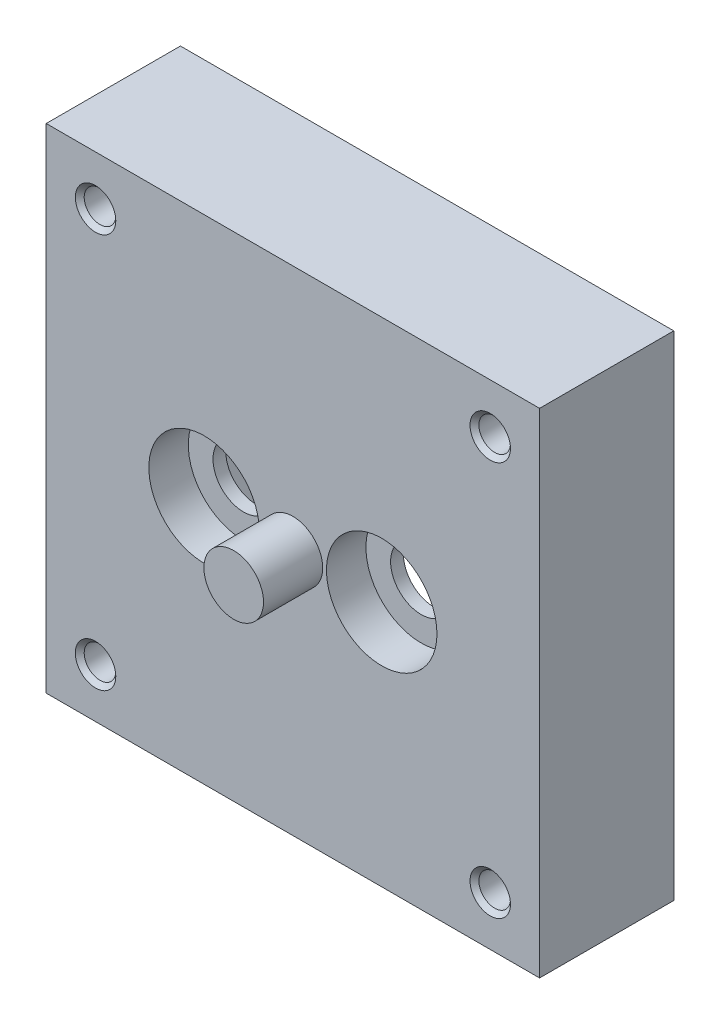
ISO-10303-21;
HEADER;
FILE_DESCRIPTION(('STEP AP214'),'2;1');
FILE_NAME('part.step','',(''),(''),'','','');
FILE_SCHEMA(('AUTOMOTIVE_DESIGN { 1 0 10303 214 1 1 1 1 }'));
ENDSEC;
DATA;
#1=APPLICATION_CONTEXT('core data for automotive mechanical design processes');
#2=APPLICATION_PROTOCOL_DEFINITION('international standard','automotive_design',2000,#1);
#3=PRODUCT_CONTEXT('',#1,'mechanical');
#4=PRODUCT('Part','Part','',(#3));
#5=PRODUCT_RELATED_PRODUCT_CATEGORY('part','',(#4));
#6=PRODUCT_DEFINITION_FORMATION('','',#4);
#7=PRODUCT_DEFINITION_CONTEXT('part definition',#1,'design');
#8=PRODUCT_DEFINITION('design','',#6,#7);
#9=PRODUCT_DEFINITION_SHAPE('','',#8);
#10=(LENGTH_UNIT() NAMED_UNIT(*) SI_UNIT(.MILLI.,.METRE.));
#11=(NAMED_UNIT(*) PLANE_ANGLE_UNIT() SI_UNIT($,.RADIAN.));
#12=(NAMED_UNIT(*) SI_UNIT($,.STERADIAN.) SOLID_ANGLE_UNIT());
#13=UNCERTAINTY_MEASURE_WITH_UNIT(LENGTH_MEASURE(1.E-05),#10,'distance_accuracy_value','');
#14=(GEOMETRIC_REPRESENTATION_CONTEXT(3) GLOBAL_UNCERTAINTY_ASSIGNED_CONTEXT((#13)) GLOBAL_UNIT_ASSIGNED_CONTEXT((#10,
#11,#12)) REPRESENTATION_CONTEXT('',''));
#15=CARTESIAN_POINT('',(0.,0.,0.));
#16=DIRECTION('',(0.,0.,1.));
#17=DIRECTION('',(1.,0.,0.));
#18=AXIS2_PLACEMENT_3D('',#15,#16,#17);
#19=CARTESIAN_POINT('',(12.5,0.,7.65));
#20=DIRECTION('',(1.,0.,0.));
#21=DIRECTION('',(0.,0.,-1.));
#22=AXIS2_PLACEMENT_3D('',#19,#20,#21);
#23=PLANE('',#22);
#24=DIRECTION('',(0.,1.,0.));
#25=VECTOR('',#24,1.);
#26=CARTESIAN_POINT('',(12.5,15.549216387895,0.85));
#27=LINE('',#26,#25);
#28=CARTESIAN_POINT('',(12.5,-12.5,0.850000000000004));
#29=VERTEX_POINT('',#28);
#30=CARTESIAN_POINT('',(12.5,12.5,0.85));
#31=VERTEX_POINT('',#30);
#32=EDGE_CURVE('E66',#29,#31,#27,.T.);
#33=ORIENTED_EDGE('',*,*,#32,.T.);
#34=DIRECTION('',(0.,0.,-1.));
#35=VECTOR('',#34,1.);
#36=CARTESIAN_POINT('',(12.5,12.5,7.65));
#37=LINE('',#36,#35);
#38=CARTESIAN_POINT('',(12.5,12.5,7.65));
#39=VERTEX_POINT('',#38);
#40=EDGE_CURVE('E58',#39,#31,#37,.T.);
#41=ORIENTED_EDGE('',*,*,#40,.F.);
#42=DIRECTION('',(0.,-1.,0.));
#43=VECTOR('',#42,1.);
#44=CARTESIAN_POINT('',(12.5,0.,7.65));
#45=LINE('',#44,#43);
#46=CARTESIAN_POINT('',(12.5,-12.5,7.65));
#47=VERTEX_POINT('',#46);
#48=EDGE_CURVE('E219',#39,#47,#45,.T.);
#49=ORIENTED_EDGE('',*,*,#48,.T.);
#50=DIRECTION('',(0.,0.,-1.));
#51=VECTOR('',#50,1.);
#52=CARTESIAN_POINT('',(12.5,-12.5,7.65));
#53=LINE('',#52,#51);
#54=EDGE_CURVE('E113',#47,#29,#53,.T.);
#55=ORIENTED_EDGE('',*,*,#54,.T.);
#56=EDGE_LOOP('',(#33,#41,#49,#55));
#57=FACE_BOUND('',#56,.T.);
#58=ADVANCED_FACE('F48',(#57),#23,.T.);
#59=CARTESIAN_POINT('',(0.,12.5,7.65));
#60=DIRECTION('',(0.,1.,0.));
#61=DIRECTION('',(0.,0.,1.));
#62=AXIS2_PLACEMENT_3D('',#59,#60,#61);
#63=PLANE('',#62);
#64=DIRECTION('',(1.,0.,0.));
#65=VECTOR('',#64,1.);
#66=CARTESIAN_POINT('',(0.,12.5,0.85));
#67=LINE('',#66,#65);
#68=CARTESIAN_POINT('',(-12.5,12.5,0.85));
#69=VERTEX_POINT('',#68);
#70=EDGE_CURVE('E99',#69,#31,#67,.T.);
#71=ORIENTED_EDGE('',*,*,#70,.F.);
#72=DIRECTION('',(0.,0.,-1.));
#73=VECTOR('',#72,1.);
#74=CARTESIAN_POINT('',(-12.5,12.5,7.65));
#75=LINE('',#74,#73);
#76=CARTESIAN_POINT('',(-12.5,12.5,7.65));
#77=VERTEX_POINT('',#76);
#78=EDGE_CURVE('E107',#77,#69,#75,.T.);
#79=ORIENTED_EDGE('',*,*,#78,.F.);
#80=DIRECTION('',(1.,0.,0.));
#81=VECTOR('',#80,1.);
#82=CARTESIAN_POINT('',(0.,12.5,7.65));
#83=LINE('',#82,#81);
#84=EDGE_CURVE('E226',#77,#39,#83,.T.);
#85=ORIENTED_EDGE('',*,*,#84,.T.);
#86=ORIENTED_EDGE('',*,*,#40,.T.);
#87=EDGE_LOOP('',(#71,#79,#85,#86));
#88=FACE_BOUND('',#87,.T.);
#89=ADVANCED_FACE('F235',(#88),#63,.T.);
#90=CARTESIAN_POINT('',(-12.5,0.,7.65));
#91=DIRECTION('',(1.,0.,0.));
#92=DIRECTION('',(0.,0.,-1.));
#93=AXIS2_PLACEMENT_3D('',#90,#91,#92);
#94=PLANE('',#93);
#95=ORIENTED_EDGE('',*,*,#78,.T.);
#96=DIRECTION('',(0.,1.,0.));
#97=VECTOR('',#96,1.);
#98=CARTESIAN_POINT('',(-12.5,15.549216387895,0.85));
#99=LINE('',#98,#97);
#100=CARTESIAN_POINT('',(-12.5,-12.5,0.850000000000003));
#101=VERTEX_POINT('',#100);
#102=EDGE_CURVE('E93',#101,#69,#99,.T.);
#103=ORIENTED_EDGE('',*,*,#102,.F.);
#104=DIRECTION('',(0.,0.,-1.));
#105=VECTOR('',#104,1.);
#106=CARTESIAN_POINT('',(-12.5,-12.5,7.65));
#107=LINE('',#106,#105);
#108=CARTESIAN_POINT('',(-12.5,-12.5,7.65));
#109=VERTEX_POINT('',#108);
#110=EDGE_CURVE('E106',#109,#101,#107,.T.);
#111=ORIENTED_EDGE('',*,*,#110,.F.);
#112=DIRECTION('',(0.,-1.,0.));
#113=VECTOR('',#112,1.);
#114=CARTESIAN_POINT('',(-12.5,0.,7.65));
#115=LINE('',#114,#113);
#116=EDGE_CURVE('E230',#77,#109,#115,.T.);
#117=ORIENTED_EDGE('',*,*,#116,.F.);
#118=EDGE_LOOP('',(#95,#103,#111,#117));
#119=FACE_BOUND('',#118,.T.);
#120=ADVANCED_FACE('F104',(#119),#94,.F.);
#121=CARTESIAN_POINT('',(0.,-12.5,7.65));
#122=DIRECTION('',(0.,1.,0.));
#123=DIRECTION('',(0.,0.,1.));
#124=AXIS2_PLACEMENT_3D('',#121,#122,#123);
#125=PLANE('',#124);
#126=ORIENTED_EDGE('',*,*,#110,.T.);
#127=DIRECTION('',(1.,0.,0.));
#128=VECTOR('',#127,1.);
#129=CARTESIAN_POINT('',(0.,-12.5,0.850000000000004));
#130=LINE('',#129,#128);
#131=EDGE_CURVE('E90',#101,#29,#130,.T.);
#132=ORIENTED_EDGE('',*,*,#131,.T.);
#133=ORIENTED_EDGE('',*,*,#54,.F.);
#134=DIRECTION('',(1.,0.,0.));
#135=VECTOR('',#134,1.);
#136=CARTESIAN_POINT('',(0.,-12.5,7.65));
#137=LINE('',#136,#135);
#138=EDGE_CURVE('E74',#109,#47,#137,.T.);
#139=ORIENTED_EDGE('',*,*,#138,.F.);
#140=EDGE_LOOP('',(#126,#132,#133,#139));
#141=FACE_BOUND('',#140,.T.);
#142=ADVANCED_FACE('F111',(#141),#125,.F.);
#143=CARTESIAN_POINT('',(0.,0.,7.65));
#144=DIRECTION('',(0.,0.,1.));
#145=DIRECTION('',(1.,0.,0.));
#146=AXIS2_PLACEMENT_3D('',#143,#144,#145);
#147=PLANE('',#146);
#148=CARTESIAN_POINT('',(-10.,10.,7.65));
#149=DIRECTION('',(0.,0.,1.));
#150=DIRECTION('',(1.,0.,0.));
#151=AXIS2_PLACEMENT_3D('',#148,#149,#150);
#152=CIRCLE('',#151,1.025);
#153=CARTESIAN_POINT('',(-8.975,10.,7.65));
#154=VERTEX_POINT('',#153);
#155=EDGE_CURVE('E335',#154,#154,#152,.T.);
#156=ORIENTED_EDGE('',*,*,#155,.F.);
#157=EDGE_LOOP('',(#156));
#158=FACE_BOUND('',#157,.T.);
#159=CARTESIAN_POINT('',(10.,10.,7.65));
#160=DIRECTION('',(0.,0.,1.));
#161=DIRECTION('',(1.,0.,0.));
#162=AXIS2_PLACEMENT_3D('',#159,#160,#161);
#163=CIRCLE('',#162,1.025);
#164=CARTESIAN_POINT('',(11.025,10.,7.65));
#165=VERTEX_POINT('',#164);
#166=EDGE_CURVE('E160',#165,#165,#163,.T.);
#167=ORIENTED_EDGE('',*,*,#166,.F.);
#168=EDGE_LOOP('',(#167));
#169=FACE_BOUND('',#168,.T.);
#170=CARTESIAN_POINT('',(-10.,-10.,7.65));
#171=DIRECTION('',(0.,0.,1.));
#172=DIRECTION('',(1.,0.,0.));
#173=AXIS2_PLACEMENT_3D('',#170,#171,#172);
#174=CIRCLE('',#173,1.025);
#175=CARTESIAN_POINT('',(-8.975,-10.,7.65));
#176=VERTEX_POINT('',#175);
#177=EDGE_CURVE('E150',#176,#176,#174,.T.);
#178=ORIENTED_EDGE('',*,*,#177,.F.);
#179=EDGE_LOOP('',(#178));
#180=FACE_BOUND('',#179,.T.);
#181=CARTESIAN_POINT('',(10.,-10.,7.65));
#182=DIRECTION('',(0.,0.,1.));
#183=DIRECTION('',(1.,0.,0.));
#184=AXIS2_PLACEMENT_3D('',#181,#182,#183);
#185=CIRCLE('',#184,1.025);
#186=CARTESIAN_POINT('',(11.025,-10.,7.65));
#187=VERTEX_POINT('',#186);
#188=EDGE_CURVE('E145',#187,#187,#185,.T.);
#189=ORIENTED_EDGE('',*,*,#188,.F.);
#190=EDGE_LOOP('',(#189));
#191=FACE_BOUND('',#190,.T.);
#192=CARTESIAN_POINT('',(4.5,0.,7.65));
#193=DIRECTION('',(0.,0.,1.));
#194=DIRECTION('',(1.,0.,0.));
#195=AXIS2_PLACEMENT_3D('',#192,#193,#194);
#196=CIRCLE('',#195,2.8);
#197=CARTESIAN_POINT('',(7.3,0.,7.65));
#198=VERTEX_POINT('',#197);
#199=EDGE_CURVE('E202',#198,#198,#196,.T.);
#200=ORIENTED_EDGE('',*,*,#199,.F.);
#201=EDGE_LOOP('',(#200));
#202=FACE_BOUND('',#201,.T.);
#203=CARTESIAN_POINT('',(-4.5,0.,7.65));
#204=DIRECTION('',(0.,0.,1.));
#205=DIRECTION('',(1.,0.,0.));
#206=AXIS2_PLACEMENT_3D('',#203,#204,#205);
#207=CIRCLE('',#206,2.8);
#208=CARTESIAN_POINT('',(-1.7,0.,7.65));
#209=VERTEX_POINT('',#208);
#210=EDGE_CURVE('E206',#209,#209,#207,.T.);
#211=ORIENTED_EDGE('',*,*,#210,.F.);
#212=EDGE_LOOP('',(#211));
#213=FACE_BOUND('',#212,.T.);
#214=CARTESIAN_POINT('',(0.,0.,7.65));
#215=DIRECTION('',(0.,0.,1.));
#216=DIRECTION('',(1.,0.,0.));
#217=AXIS2_PLACEMENT_3D('',#214,#215,#216);
#218=CIRCLE('',#217,1.51);
#219=CARTESIAN_POINT('',(1.51,0.,7.65));
#220=VERTEX_POINT('',#219);
#221=EDGE_CURVE('E215',#220,#220,#218,.T.);
#222=ORIENTED_EDGE('',*,*,#221,.F.);
#223=EDGE_LOOP('',(#222));
#224=FACE_BOUND('',#223,.T.);
#225=ORIENTED_EDGE('',*,*,#48,.F.);
#226=ORIENTED_EDGE('',*,*,#84,.F.);
#227=ORIENTED_EDGE('',*,*,#116,.T.);
#228=ORIENTED_EDGE('',*,*,#138,.T.);
#229=EDGE_LOOP('',(#225,#226,#227,#228));
#230=FACE_BOUND('',#229,.T.);
#231=ADVANCED_FACE('F233',(#158,#169,#180,#191,#202,#213,#224,#230),#147,.T.);
#232=CARTESIAN_POINT('',(0.,0.,10.65));
#233=DIRECTION('',(0.,0.,-1.));
#234=DIRECTION('',(-1.,0.,0.));
#235=AXIS2_PLACEMENT_3D('',#232,#233,#234);
#236=CYLINDRICAL_SURFACE('',#235,1.51);
#237=CARTESIAN_POINT('',(0.,0.,10.65));
#238=DIRECTION('',(0.,0.,1.));
#239=DIRECTION('',(1.,0.,0.));
#240=AXIS2_PLACEMENT_3D('',#237,#238,#239);
#241=CIRCLE('',#240,1.51);
#242=CARTESIAN_POINT('',(1.51,0.,10.65));
#243=VERTEX_POINT('',#242);
#244=EDGE_CURVE('E216',#243,#243,#241,.T.);
#245=ORIENTED_EDGE('',*,*,#244,.F.);
#246=EDGE_LOOP('',(#245));
#247=FACE_BOUND('',#246,.T.);
#248=ORIENTED_EDGE('',*,*,#221,.T.);
#249=EDGE_LOOP('',(#248));
#250=FACE_BOUND('',#249,.T.);
#251=ADVANCED_FACE('F249',(#247,#250),#236,.T.);
#252=CARTESIAN_POINT('',(0.,0.,10.65));
#253=DIRECTION('',(0.,0.,1.));
#254=DIRECTION('',(1.,0.,0.));
#255=AXIS2_PLACEMENT_3D('',#252,#253,#254);
#256=PLANE('',#255);
#257=ORIENTED_EDGE('',*,*,#244,.T.);
#258=EDGE_LOOP('',(#257));
#259=FACE_BOUND('',#258,.T.);
#260=ADVANCED_FACE('F253',(#259),#256,.T.);
#261=CARTESIAN_POINT('',(0.,0.,5.));
#262=DIRECTION('',(0.,0.,-1.));
#263=DIRECTION('',(-1.,0.,0.));
#264=AXIS2_PLACEMENT_3D('',#261,#262,#263);
#265=CYLINDRICAL_SURFACE('',#264,7.5);
#266=CARTESIAN_POINT('',(0.,0.,5.));
#267=DIRECTION('',(0.,0.,-1.));
#268=DIRECTION('',(-1.,0.,0.));
#269=AXIS2_PLACEMENT_3D('',#266,#267,#268);
#270=CIRCLE('',#269,7.5);
#271=CARTESIAN_POINT('',(-7.5,0.,5.));
#272=VERTEX_POINT('',#271);
#273=EDGE_CURVE('E201',#272,#272,#270,.T.);
#274=ORIENTED_EDGE('',*,*,#273,.F.);
#275=EDGE_LOOP('',(#274));
#276=FACE_BOUND('',#275,.T.);
#277=CARTESIAN_POINT('',(0.,0.,0.350000000000002));
#278=DIRECTION('',(0.,0.,-1.));
#279=DIRECTION('',(0.,1.,0.));
#280=AXIS2_PLACEMENT_3D('',#277,#278,#279);
#281=CIRCLE('',#280,7.5);
#282=CARTESIAN_POINT('',(0.,7.5,0.350000000000001));
#283=VERTEX_POINT('',#282);
#284=EDGE_CURVE('E140',#283,#283,#281,.F.);
#285=ORIENTED_EDGE('',*,*,#284,.F.);
#286=EDGE_LOOP('',(#285));
#287=FACE_BOUND('',#286,.T.);
#288=ADVANCED_FACE('F257',(#276,#287),#265,.F.);
#289=CARTESIAN_POINT('',(0.,0.,5.));
#290=DIRECTION('',(0.,0.,-1.));
#291=DIRECTION('',(-1.,0.,0.));
#292=AXIS2_PLACEMENT_3D('',#289,#290,#291);
#293=PLANE('',#292);
#294=CARTESIAN_POINT('',(4.5,0.,5.));
#295=DIRECTION('',(0.,0.,-1.));
#296=DIRECTION('',(-1.,0.,0.));
#297=AXIS2_PLACEMENT_3D('',#294,#295,#296);
#298=CIRCLE('',#297,1.55);
#299=CARTESIAN_POINT('',(2.95,0.,5.));
#300=VERTEX_POINT('',#299);
#301=EDGE_CURVE('E130',#300,#300,#298,.T.);
#302=ORIENTED_EDGE('',*,*,#301,.F.);
#303=EDGE_LOOP('',(#302));
#304=FACE_BOUND('',#303,.T.);
#305=CARTESIAN_POINT('',(-4.5,0.,5.));
#306=DIRECTION('',(0.,0.,-1.));
#307=DIRECTION('',(-1.,0.,0.));
#308=AXIS2_PLACEMENT_3D('',#305,#306,#307);
#309=CIRCLE('',#308,1.55);
#310=CARTESIAN_POINT('',(-6.05,0.,5.));
#311=VERTEX_POINT('',#310);
#312=EDGE_CURVE('E126',#311,#311,#309,.T.);
#313=ORIENTED_EDGE('',*,*,#312,.F.);
#314=EDGE_LOOP('',(#313));
#315=FACE_BOUND('',#314,.T.);
#316=ORIENTED_EDGE('',*,*,#273,.T.);
#317=EDGE_LOOP('',(#316));
#318=FACE_BOUND('',#317,.T.);
#319=ADVANCED_FACE('F261',(#304,#315,#318),#293,.T.);
#320=CARTESIAN_POINT('',(-4.5,0.,5.65));
#321=DIRECTION('',(0.,0.,1.));
#322=DIRECTION('',(1.,0.,0.));
#323=AXIS2_PLACEMENT_3D('',#320,#321,#322);
#324=CYLINDRICAL_SURFACE('',#323,2.8);
#325=CARTESIAN_POINT('',(-4.5,0.,5.65));
#326=DIRECTION('',(0.,0.,1.));
#327=DIRECTION('',(1.,0.,0.));
#328=AXIS2_PLACEMENT_3D('',#325,#326,#327);
#329=CIRCLE('',#328,2.8);
#330=CARTESIAN_POINT('',(-1.7,0.,5.65));
#331=VERTEX_POINT('',#330);
#332=EDGE_CURVE('E134',#331,#331,#329,.T.);
#333=ORIENTED_EDGE('',*,*,#332,.F.);
#334=EDGE_LOOP('',(#333));
#335=FACE_BOUND('',#334,.T.);
#336=ORIENTED_EDGE('',*,*,#210,.T.);
#337=EDGE_LOOP('',(#336));
#338=FACE_BOUND('',#337,.T.);
#339=ADVANCED_FACE('F265',(#335,#338),#324,.F.);
#340=CARTESIAN_POINT('',(-4.5,0.,5.65));
#341=DIRECTION('',(0.,0.,1.));
#342=DIRECTION('',(1.,0.,0.));
#343=AXIS2_PLACEMENT_3D('',#340,#341,#342);
#344=PLANE('',#343);
#345=CARTESIAN_POINT('',(-4.5,0.,5.65));
#346=DIRECTION('',(0.,0.,1.));
#347=DIRECTION('',(1.,0.,0.));
#348=AXIS2_PLACEMENT_3D('',#345,#346,#347);
#349=CIRCLE('',#348,1.55);
#350=CARTESIAN_POINT('',(-2.95,0.,5.65));
#351=VERTEX_POINT('',#350);
#352=EDGE_CURVE('E190',#351,#351,#349,.T.);
#353=ORIENTED_EDGE('',*,*,#352,.F.);
#354=EDGE_LOOP('',(#353));
#355=FACE_BOUND('',#354,.T.);
#356=ORIENTED_EDGE('',*,*,#332,.T.);
#357=EDGE_LOOP('',(#356));
#358=FACE_BOUND('',#357,.T.);
#359=ADVANCED_FACE('F267',(#355,#358),#344,.T.);
#360=CARTESIAN_POINT('',(4.5,0.,5.65));
#361=DIRECTION('',(0.,0.,1.));
#362=DIRECTION('',(1.,0.,0.));
#363=AXIS2_PLACEMENT_3D('',#360,#361,#362);
#364=CYLINDRICAL_SURFACE('',#363,2.8);
#365=CARTESIAN_POINT('',(4.5,0.,5.65));
#366=DIRECTION('',(0.,0.,1.));
#367=DIRECTION('',(1.,0.,0.));
#368=AXIS2_PLACEMENT_3D('',#365,#366,#367);
#369=CIRCLE('',#368,2.8);
#370=CARTESIAN_POINT('',(7.3,0.,5.65));
#371=VERTEX_POINT('',#370);
#372=EDGE_CURVE('E197',#371,#371,#369,.T.);
#373=ORIENTED_EDGE('',*,*,#372,.F.);
#374=EDGE_LOOP('',(#373));
#375=FACE_BOUND('',#374,.T.);
#376=ORIENTED_EDGE('',*,*,#199,.T.);
#377=EDGE_LOOP('',(#376));
#378=FACE_BOUND('',#377,.T.);
#379=ADVANCED_FACE('F270',(#375,#378),#364,.F.);
#380=CARTESIAN_POINT('',(4.5,0.,5.65));
#381=DIRECTION('',(0.,0.,1.));
#382=DIRECTION('',(1.,0.,0.));
#383=AXIS2_PLACEMENT_3D('',#380,#381,#382);
#384=PLANE('',#383);
#385=CARTESIAN_POINT('',(4.5,0.,5.65));
#386=DIRECTION('',(0.,0.,1.));
#387=DIRECTION('',(1.,0.,0.));
#388=AXIS2_PLACEMENT_3D('',#385,#386,#387);
#389=CIRCLE('',#388,1.55);
#390=CARTESIAN_POINT('',(6.05,0.,5.65));
#391=VERTEX_POINT('',#390);
#392=EDGE_CURVE('E131',#391,#391,#389,.T.);
#393=ORIENTED_EDGE('',*,*,#392,.F.);
#394=EDGE_LOOP('',(#393));
#395=FACE_BOUND('',#394,.T.);
#396=ORIENTED_EDGE('',*,*,#372,.T.);
#397=EDGE_LOOP('',(#396));
#398=FACE_BOUND('',#397,.T.);
#399=ADVANCED_FACE('F277',(#395,#398),#384,.T.);
#400=CARTESIAN_POINT('',(-4.5,0.,3.65));
#401=DIRECTION('',(0.,0.,1.));
#402=DIRECTION('',(1.,0.,0.));
#403=AXIS2_PLACEMENT_3D('',#400,#401,#402);
#404=CYLINDRICAL_SURFACE('',#403,1.55);
#405=ORIENTED_EDGE('',*,*,#312,.T.);
#406=EDGE_LOOP('',(#405));
#407=FACE_BOUND('',#406,.T.);
#408=ORIENTED_EDGE('',*,*,#352,.T.);
#409=EDGE_LOOP('',(#408));
#410=FACE_BOUND('',#409,.T.);
#411=ADVANCED_FACE('F281',(#407,#410),#404,.F.);
#412=CARTESIAN_POINT('',(4.5,0.,3.65));
#413=DIRECTION('',(0.,0.,1.));
#414=DIRECTION('',(1.,0.,0.));
#415=AXIS2_PLACEMENT_3D('',#412,#413,#414);
#416=CYLINDRICAL_SURFACE('',#415,1.55);
#417=ORIENTED_EDGE('',*,*,#301,.T.);
#418=EDGE_LOOP('',(#417));
#419=FACE_BOUND('',#418,.T.);
#420=ORIENTED_EDGE('',*,*,#392,.T.);
#421=EDGE_LOOP('',(#420));
#422=FACE_BOUND('',#421,.T.);
#423=ADVANCED_FACE('F285',(#419,#422),#416,.F.);
#424=CARTESIAN_POINT('',(12.5,15.549216387895,0.85));
#425=DIRECTION('',(0.,0.,1.));
#426=DIRECTION('',(0.,-1.,0.));
#427=AXIS2_PLACEMENT_3D('',#424,#425,#426);
#428=PLANE('',#427);
#429=CARTESIAN_POINT('',(-10.,10.,0.850000000000001));
#430=DIRECTION('',(0.,0.,1.));
#431=DIRECTION('',(0.,-1.,0.));
#432=AXIS2_PLACEMENT_3D('',#429,#430,#431);
#433=CIRCLE('',#432,0.799999999999999);
#434=CARTESIAN_POINT('',(-10.,9.2,0.850000000000001));
#435=VERTEX_POINT('',#434);
#436=EDGE_CURVE('E52',#435,#435,#433,.T.);
#437=ORIENTED_EDGE('',*,*,#436,.T.);
#438=EDGE_LOOP('',(#437));
#439=FACE_BOUND('',#438,.T.);
#440=CARTESIAN_POINT('',(10.,10.,0.850000000000001));
#441=DIRECTION('',(0.,0.,1.));
#442=DIRECTION('',(0.,-1.,0.));
#443=AXIS2_PLACEMENT_3D('',#440,#441,#442);
#444=CIRCLE('',#443,0.799999999999999);
#445=CARTESIAN_POINT('',(10.,9.2,0.850000000000001));
#446=VERTEX_POINT('',#445);
#447=EDGE_CURVE('E147',#446,#446,#444,.T.);
#448=ORIENTED_EDGE('',*,*,#447,.T.);
#449=EDGE_LOOP('',(#448));
#450=FACE_BOUND('',#449,.T.);
#451=CARTESIAN_POINT('',(-10.,-10.,0.850000000000004));
#452=DIRECTION('',(0.,0.,1.));
#453=DIRECTION('',(0.,-1.,0.));
#454=AXIS2_PLACEMENT_3D('',#451,#452,#453);
#455=CIRCLE('',#454,0.799999999999999);
#456=CARTESIAN_POINT('',(-10.,-10.8,0.850000000000004));
#457=VERTEX_POINT('',#456);
#458=EDGE_CURVE('E142',#457,#457,#455,.T.);
#459=ORIENTED_EDGE('',*,*,#458,.T.);
#460=EDGE_LOOP('',(#459));
#461=FACE_BOUND('',#460,.T.);
#462=CARTESIAN_POINT('',(10.,-10.,0.850000000000004));
#463=DIRECTION('',(0.,0.,1.));
#464=DIRECTION('',(0.,-1.,0.));
#465=AXIS2_PLACEMENT_3D('',#462,#463,#464);
#466=CIRCLE('',#465,0.799999999999999);
#467=CARTESIAN_POINT('',(10.,-10.8,0.850000000000004));
#468=VERTEX_POINT('',#467);
#469=EDGE_CURVE('E136',#468,#468,#466,.T.);
#470=ORIENTED_EDGE('',*,*,#469,.T.);
#471=EDGE_LOOP('',(#470));
#472=FACE_BOUND('',#471,.T.);
#473=CARTESIAN_POINT('',(0.,0.,0.850000000000002));
#474=DIRECTION('',(0.,0.,1.));
#475=DIRECTION('',(0.,-1.,0.));
#476=AXIS2_PLACEMENT_3D('',#473,#474,#475);
#477=CIRCLE('',#476,11.3228756555323);
#478=CARTESIAN_POINT('',(0.,-11.3228756555323,0.850000000000003));
#479=VERTEX_POINT('',#478);
#480=EDGE_CURVE('E11',#479,#479,#477,.T.);
#481=ORIENTED_EDGE('',*,*,#480,.T.);
#482=EDGE_LOOP('',(#481));
#483=FACE_BOUND('',#482,.T.);
#484=ORIENTED_EDGE('',*,*,#70,.T.);
#485=ORIENTED_EDGE('',*,*,#32,.F.);
#486=ORIENTED_EDGE('',*,*,#131,.F.);
#487=ORIENTED_EDGE('',*,*,#102,.T.);
#488=EDGE_LOOP('',(#484,#485,#486,#487));
#489=FACE_BOUND('',#488,.T.);
#490=ADVANCED_FACE('F92',(#439,#450,#461,#472,#483,#489),#428,.F.);
#491=CARTESIAN_POINT('',(0.,0.,0.350000000000002));
#492=DIRECTION('',(0.,0.,-1.));
#493=DIRECTION('',(0.,1.,0.));
#494=AXIS2_PLACEMENT_3D('',#491,#492,#493);
#495=PLANE('',#494);
#496=ORIENTED_EDGE('',*,*,#284,.T.);
#497=EDGE_LOOP('',(#496));
#498=FACE_BOUND('',#497,.T.);
#499=CARTESIAN_POINT('',(0.,0.,0.350000000000002));
#500=DIRECTION('',(0.,0.,-1.));
#501=DIRECTION('',(0.,1.,0.));
#502=AXIS2_PLACEMENT_3D('',#499,#500,#501);
#503=CIRCLE('',#502,10.);
#504=CARTESIAN_POINT('',(0.,10.,0.350000000000001));
#505=VERTEX_POINT('',#504);
#506=EDGE_CURVE('E109',#505,#505,#503,.T.);
#507=ORIENTED_EDGE('',*,*,#506,.T.);
#508=EDGE_LOOP('',(#507));
#509=FACE_BOUND('',#508,.T.);
#510=ADVANCED_FACE('F292',(#498,#509),#495,.T.);
#511=CARTESIAN_POINT('',(0.,0.,-1.15));
#512=DIRECTION('',(0.,0.,1.));
#513=DIRECTION('',(0.,-1.,0.));
#514=AXIS2_PLACEMENT_3D('',#511,#512,#513);
#515=TOROIDAL_SURFACE('',#514,11.3228756555323,2.);
#516=ORIENTED_EDGE('',*,*,#480,.F.);
#517=EDGE_LOOP('',(#516));
#518=FACE_BOUND('',#517,.T.);
#519=ORIENTED_EDGE('',*,*,#506,.F.);
#520=EDGE_LOOP('',(#519));
#521=FACE_BOUND('',#520,.T.);
#522=ADVANCED_FACE('F50',(#518,#521),#515,.F.);
#523=CARTESIAN_POINT('',(10.,-10.,7.65));
#524=DIRECTION('',(0.,0.,1.));
#525=DIRECTION('',(1.,0.,0.));
#526=AXIS2_PLACEMENT_3D('',#523,#524,#525);
#527=CYLINDRICAL_SURFACE('',#526,0.799999999999999);
#528=CARTESIAN_POINT('',(10.,-10.,7.425));
#529=DIRECTION('',(0.,0.,1.));
#530=DIRECTION('',(1.,0.,0.));
#531=AXIS2_PLACEMENT_3D('',#528,#529,#530);
#532=CIRCLE('',#531,0.799999999999999);
#533=CARTESIAN_POINT('',(10.8,-10.,7.425));
#534=VERTEX_POINT('',#533);
#535=EDGE_CURVE('E141',#534,#534,#532,.T.);
#536=ORIENTED_EDGE('',*,*,#535,.T.);
#537=EDGE_LOOP('',(#536));
#538=FACE_BOUND('',#537,.T.);
#539=ORIENTED_EDGE('',*,*,#469,.F.);
#540=EDGE_LOOP('',(#539));
#541=FACE_BOUND('',#540,.T.);
#542=ADVANCED_FACE('F297',(#538,#541),#527,.F.);
#543=CARTESIAN_POINT('',(10.,-10.,7.65));
#544=DIRECTION('',(0.,0.,1.));
#545=DIRECTION('',(1.,0.,0.));
#546=AXIS2_PLACEMENT_3D('',#543,#544,#545);
#547=CONICAL_SURFACE('',#546,1.025,0.785398163397448);
#548=ORIENTED_EDGE('',*,*,#535,.F.);
#549=EDGE_LOOP('',(#548));
#550=FACE_BOUND('',#549,.T.);
#551=ORIENTED_EDGE('',*,*,#188,.T.);
#552=EDGE_LOOP('',(#551));
#553=FACE_BOUND('',#552,.T.);
#554=ADVANCED_FACE('F300',(#550,#553),#547,.F.);
#555=CARTESIAN_POINT('',(-10.,-10.,7.65));
#556=DIRECTION('',(0.,0.,1.));
#557=DIRECTION('',(1.,0.,0.));
#558=AXIS2_PLACEMENT_3D('',#555,#556,#557);
#559=CYLINDRICAL_SURFACE('',#558,0.799999999999999);
#560=CARTESIAN_POINT('',(-10.,-10.,7.425));
#561=DIRECTION('',(0.,0.,1.));
#562=DIRECTION('',(1.,0.,0.));
#563=AXIS2_PLACEMENT_3D('',#560,#561,#562);
#564=CIRCLE('',#563,0.799999999999999);
#565=CARTESIAN_POINT('',(-9.2,-10.,7.425));
#566=VERTEX_POINT('',#565);
#567=EDGE_CURVE('E146',#566,#566,#564,.T.);
#568=ORIENTED_EDGE('',*,*,#567,.T.);
#569=EDGE_LOOP('',(#568));
#570=FACE_BOUND('',#569,.T.);
#571=ORIENTED_EDGE('',*,*,#458,.F.);
#572=EDGE_LOOP('',(#571));
#573=FACE_BOUND('',#572,.T.);
#574=ADVANCED_FACE('F304',(#570,#573),#559,.F.);
#575=CARTESIAN_POINT('',(-10.,-10.,7.65));
#576=DIRECTION('',(0.,0.,1.));
#577=DIRECTION('',(1.,0.,0.));
#578=AXIS2_PLACEMENT_3D('',#575,#576,#577);
#579=CONICAL_SURFACE('',#578,1.025,0.785398163397448);
#580=ORIENTED_EDGE('',*,*,#567,.F.);
#581=EDGE_LOOP('',(#580));
#582=FACE_BOUND('',#581,.T.);
#583=ORIENTED_EDGE('',*,*,#177,.T.);
#584=EDGE_LOOP('',(#583));
#585=FACE_BOUND('',#584,.T.);
#586=ADVANCED_FACE('F308',(#582,#585),#579,.F.);
#587=CARTESIAN_POINT('',(10.,10.,7.65));
#588=DIRECTION('',(0.,0.,1.));
#589=DIRECTION('',(1.,0.,0.));
#590=AXIS2_PLACEMENT_3D('',#587,#588,#589);
#591=CYLINDRICAL_SURFACE('',#590,0.799999999999999);
#592=CARTESIAN_POINT('',(10.,10.,7.425));
#593=DIRECTION('',(0.,0.,1.));
#594=DIRECTION('',(1.,0.,0.));
#595=AXIS2_PLACEMENT_3D('',#592,#593,#594);
#596=CIRCLE('',#595,0.799999999999999);
#597=CARTESIAN_POINT('',(10.8,10.,7.425));
#598=VERTEX_POINT('',#597);
#599=EDGE_CURVE('E151',#598,#598,#596,.T.);
#600=ORIENTED_EDGE('',*,*,#599,.T.);
#601=EDGE_LOOP('',(#600));
#602=FACE_BOUND('',#601,.T.);
#603=ORIENTED_EDGE('',*,*,#447,.F.);
#604=EDGE_LOOP('',(#603));
#605=FACE_BOUND('',#604,.T.);
#606=ADVANCED_FACE('F312',(#602,#605),#591,.F.);
#607=CARTESIAN_POINT('',(10.,10.,7.65));
#608=DIRECTION('',(0.,0.,1.));
#609=DIRECTION('',(1.,0.,0.));
#610=AXIS2_PLACEMENT_3D('',#607,#608,#609);
#611=CONICAL_SURFACE('',#610,1.025,0.785398163397448);
#612=ORIENTED_EDGE('',*,*,#599,.F.);
#613=EDGE_LOOP('',(#612));
#614=FACE_BOUND('',#613,.T.);
#615=ORIENTED_EDGE('',*,*,#166,.T.);
#616=EDGE_LOOP('',(#615));
#617=FACE_BOUND('',#616,.T.);
#618=ADVANCED_FACE('F316',(#614,#617),#611,.F.);
#619=CARTESIAN_POINT('',(-10.,10.,7.65));
#620=DIRECTION('',(0.,0.,1.));
#621=DIRECTION('',(1.,0.,0.));
#622=AXIS2_PLACEMENT_3D('',#619,#620,#621);
#623=CYLINDRICAL_SURFACE('',#622,0.799999999999999);
#624=CARTESIAN_POINT('',(-10.,10.,7.425));
#625=DIRECTION('',(0.,0.,1.));
#626=DIRECTION('',(1.,0.,0.));
#627=AXIS2_PLACEMENT_3D('',#624,#625,#626);
#628=CIRCLE('',#627,0.799999999999999);
#629=CARTESIAN_POINT('',(-9.2,10.,7.425));
#630=VERTEX_POINT('',#629);
#631=EDGE_CURVE('E332',#630,#630,#628,.T.);
#632=ORIENTED_EDGE('',*,*,#631,.T.);
#633=EDGE_LOOP('',(#632));
#634=FACE_BOUND('',#633,.T.);
#635=ORIENTED_EDGE('',*,*,#436,.F.);
#636=EDGE_LOOP('',(#635));
#637=FACE_BOUND('',#636,.T.);
#638=ADVANCED_FACE('F319',(#634,#637),#623,.F.);
#639=CARTESIAN_POINT('',(-10.,10.,7.65));
#640=DIRECTION('',(0.,0.,1.));
#641=DIRECTION('',(1.,0.,0.));
#642=AXIS2_PLACEMENT_3D('',#639,#640,#641);
#643=CONICAL_SURFACE('',#642,1.025,0.785398163397448);
#644=ORIENTED_EDGE('',*,*,#631,.F.);
#645=EDGE_LOOP('',(#644));
#646=FACE_BOUND('',#645,.T.);
#647=ORIENTED_EDGE('',*,*,#155,.T.);
#648=EDGE_LOOP('',(#647));
#649=FACE_BOUND('',#648,.T.);
#650=ADVANCED_FACE('F323',(#646,#649),#643,.F.);
#651=CLOSED_SHELL('',(#58,#89,#120,#142,#231,#251,#260,#288,#319,#339,#359,#379,#399,#411,#423,
#490,#510,#522,#542,#554,#574,#586,#606,#618,#638,#650));
#652=MANIFOLD_SOLID_BREP('B2',#651);
#653=ADVANCED_BREP_SHAPE_REPRESENTATION('',(#18,#652),#14);
#654=SHAPE_DEFINITION_REPRESENTATION(#9,#653);
ENDSEC;
END-ISO-10303-21;
